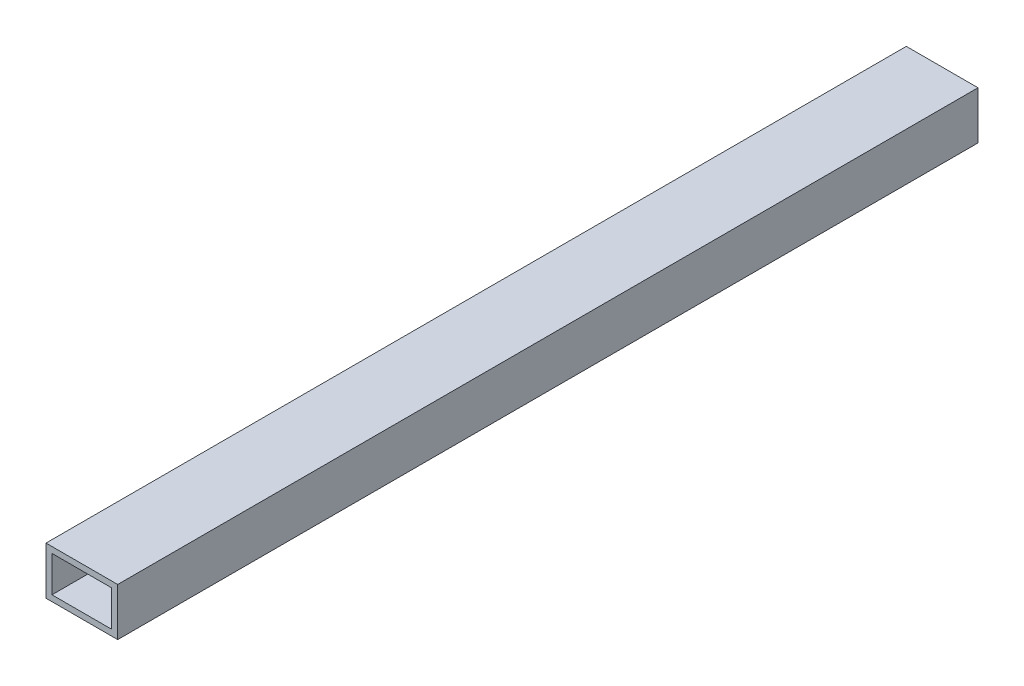
ISO-10303-21;
HEADER;
FILE_DESCRIPTION(('STEP AP214'),'2;1');
FILE_NAME('part.step','',(''),(''),'','','');
FILE_SCHEMA(('AUTOMOTIVE_DESIGN { 1 0 10303 214 1 1 1 1 }'));
ENDSEC;
DATA;
#1=APPLICATION_CONTEXT('core data for automotive mechanical design processes');
#2=APPLICATION_PROTOCOL_DEFINITION('international standard','automotive_design',2000,#1);
#3=PRODUCT_CONTEXT('',#1,'mechanical');
#4=PRODUCT('Part','Part','',(#3));
#5=PRODUCT_RELATED_PRODUCT_CATEGORY('part','',(#4));
#6=PRODUCT_DEFINITION_FORMATION('','',#4);
#7=PRODUCT_DEFINITION_CONTEXT('part definition',#1,'design');
#8=PRODUCT_DEFINITION('design','',#6,#7);
#9=PRODUCT_DEFINITION_SHAPE('','',#8);
#10=(LENGTH_UNIT() NAMED_UNIT(*) SI_UNIT(.MILLI.,.METRE.));
#11=(NAMED_UNIT(*) PLANE_ANGLE_UNIT() SI_UNIT($,.RADIAN.));
#12=(NAMED_UNIT(*) SI_UNIT($,.STERADIAN.) SOLID_ANGLE_UNIT());
#13=UNCERTAINTY_MEASURE_WITH_UNIT(LENGTH_MEASURE(1.E-05),#10,'distance_accuracy_value','');
#14=(GEOMETRIC_REPRESENTATION_CONTEXT(3) GLOBAL_UNCERTAINTY_ASSIGNED_CONTEXT((#13)) GLOBAL_UNIT_ASSIGNED_CONTEXT((#10,
#11,#12)) REPRESENTATION_CONTEXT('',''));
#15=CARTESIAN_POINT('',(0.,0.,0.));
#16=DIRECTION('',(0.,0.,1.));
#17=DIRECTION('',(1.,0.,0.));
#18=AXIS2_PLACEMENT_3D('',#15,#16,#17);
#19=CARTESIAN_POINT('',(0.,0.,228.6));
#20=DIRECTION('',(0.,0.,1.));
#21=DIRECTION('',(1.,0.,0.));
#22=AXIS2_PLACEMENT_3D('',#19,#20,#21);
#23=PLANE('',#22);
#24=DIRECTION('',(0.,-1.,0.));
#25=VECTOR('',#24,1.);
#26=CARTESIAN_POINT('',(-19.05,-12.7,228.6));
#27=LINE('',#26,#25);
#28=CARTESIAN_POINT('',(-19.05,12.7,228.6));
#29=VERTEX_POINT('',#28);
#30=CARTESIAN_POINT('',(-19.05,-12.7,228.6));
#31=VERTEX_POINT('',#30);
#32=EDGE_CURVE('E117',#29,#31,#27,.T.);
#33=ORIENTED_EDGE('',*,*,#32,.T.);
#34=DIRECTION('',(1.,0.,0.));
#35=VECTOR('',#34,1.);
#36=CARTESIAN_POINT('',(19.05,-12.7,228.6));
#37=LINE('',#36,#35);
#38=CARTESIAN_POINT('',(19.05,-12.7,228.6));
#39=VERTEX_POINT('',#38);
#40=EDGE_CURVE('E176',#31,#39,#37,.T.);
#41=ORIENTED_EDGE('',*,*,#40,.T.);
#42=DIRECTION('',(0.,1.,0.));
#43=VECTOR('',#42,1.);
#44=CARTESIAN_POINT('',(19.05,-12.7,228.6));
#45=LINE('',#44,#43);
#46=CARTESIAN_POINT('',(19.05,12.7,228.6));
#47=VERTEX_POINT('',#46);
#48=EDGE_CURVE('E179',#39,#47,#45,.T.);
#49=ORIENTED_EDGE('',*,*,#48,.T.);
#50=DIRECTION('',(-1.,0.,0.));
#51=VECTOR('',#50,1.);
#52=CARTESIAN_POINT('',(19.05,12.7,228.6));
#53=LINE('',#52,#51);
#54=EDGE_CURVE('E63',#47,#29,#53,.T.);
#55=ORIENTED_EDGE('',*,*,#54,.T.);
#56=EDGE_LOOP('',(#33,#41,#49,#55));
#57=FACE_BOUND('',#56,.T.);
#58=DIRECTION('',(1.,0.,0.));
#59=VECTOR('',#58,1.);
#60=CARTESIAN_POINT('',(15.875,-9.525,228.6));
#61=LINE('',#60,#59);
#62=CARTESIAN_POINT('',(-15.875,-9.525,228.6));
#63=VERTEX_POINT('',#62);
#64=CARTESIAN_POINT('',(15.875,-9.525,228.6));
#65=VERTEX_POINT('',#64);
#66=EDGE_CURVE('E158',#63,#65,#61,.T.);
#67=ORIENTED_EDGE('',*,*,#66,.F.);
#68=DIRECTION('',(0.,-1.,0.));
#69=VECTOR('',#68,1.);
#70=CARTESIAN_POINT('',(-15.875,-9.525,228.6));
#71=LINE('',#70,#69);
#72=CARTESIAN_POINT('',(-15.875,9.525,228.6));
#73=VERTEX_POINT('',#72);
#74=EDGE_CURVE('E113',#73,#63,#71,.T.);
#75=ORIENTED_EDGE('',*,*,#74,.F.);
#76=DIRECTION('',(-1.,0.,0.));
#77=VECTOR('',#76,1.);
#78=CARTESIAN_POINT('',(15.875,9.525,228.6));
#79=LINE('',#78,#77);
#80=CARTESIAN_POINT('',(15.875,9.525,228.6));
#81=VERTEX_POINT('',#80);
#82=EDGE_CURVE('E164',#81,#73,#79,.T.);
#83=ORIENTED_EDGE('',*,*,#82,.F.);
#84=DIRECTION('',(0.,1.,0.));
#85=VECTOR('',#84,1.);
#86=CARTESIAN_POINT('',(15.875,-9.525,228.6));
#87=LINE('',#86,#85);
#88=EDGE_CURVE('E161',#65,#81,#87,.T.);
#89=ORIENTED_EDGE('',*,*,#88,.F.);
#90=EDGE_LOOP('',(#67,#75,#83,#89));
#91=FACE_BOUND('',#90,.T.);
#92=ADVANCED_FACE('F39',(#57,#91),#23,.T.);
#93=CARTESIAN_POINT('',(-19.05,-12.7,228.6));
#94=DIRECTION('',(1.,0.,0.));
#95=DIRECTION('',(0.,0.,-1.));
#96=AXIS2_PLACEMENT_3D('',#93,#94,#95);
#97=PLANE('',#96);
#98=DIRECTION('',(0.,0.,-1.));
#99=VECTOR('',#98,1.);
#100=CARTESIAN_POINT('',(-19.05,12.7,228.6));
#101=LINE('',#100,#99);
#102=CARTESIAN_POINT('',(-19.05,12.7,-228.6));
#103=VERTEX_POINT('',#102);
#104=EDGE_CURVE('E184',#29,#103,#101,.T.);
#105=ORIENTED_EDGE('',*,*,#104,.T.);
#106=DIRECTION('',(0.,-1.,0.));
#107=VECTOR('',#106,1.);
#108=CARTESIAN_POINT('',(-19.05,-12.7,-228.6));
#109=LINE('',#108,#107);
#110=CARTESIAN_POINT('',(-19.05,-12.7,-228.6));
#111=VERTEX_POINT('',#110);
#112=EDGE_CURVE('E140',#103,#111,#109,.T.);
#113=ORIENTED_EDGE('',*,*,#112,.T.);
#114=DIRECTION('',(0.,0.,-1.));
#115=VECTOR('',#114,1.);
#116=CARTESIAN_POINT('',(-19.05,-12.7,228.6));
#117=LINE('',#116,#115);
#118=EDGE_CURVE('E11',#31,#111,#117,.T.);
#119=ORIENTED_EDGE('',*,*,#118,.F.);
#120=ORIENTED_EDGE('',*,*,#32,.F.);
#121=EDGE_LOOP('',(#105,#113,#119,#120));
#122=FACE_BOUND('',#121,.T.);
#123=ADVANCED_FACE('F41',(#122),#97,.F.);
#124=CARTESIAN_POINT('',(19.05,-12.7,228.6));
#125=DIRECTION('',(0.,1.,0.));
#126=DIRECTION('',(0.,0.,1.));
#127=AXIS2_PLACEMENT_3D('',#124,#125,#126);
#128=PLANE('',#127);
#129=ORIENTED_EDGE('',*,*,#118,.T.);
#130=DIRECTION('',(1.,0.,0.));
#131=VECTOR('',#130,1.);
#132=CARTESIAN_POINT('',(19.05,-12.7,-228.6));
#133=LINE('',#132,#131);
#134=CARTESIAN_POINT('',(19.05,-12.7,-228.6));
#135=VERTEX_POINT('',#134);
#136=EDGE_CURVE('E144',#111,#135,#133,.T.);
#137=ORIENTED_EDGE('',*,*,#136,.T.);
#138=DIRECTION('',(0.,0.,-1.));
#139=VECTOR('',#138,1.);
#140=CARTESIAN_POINT('',(19.05,-12.7,228.6));
#141=LINE('',#140,#139);
#142=EDGE_CURVE('E48',#39,#135,#141,.T.);
#143=ORIENTED_EDGE('',*,*,#142,.F.);
#144=ORIENTED_EDGE('',*,*,#40,.F.);
#145=EDGE_LOOP('',(#129,#137,#143,#144));
#146=FACE_BOUND('',#145,.T.);
#147=ADVANCED_FACE('F200',(#146),#128,.F.);
#148=CARTESIAN_POINT('',(19.05,-12.7,228.6));
#149=DIRECTION('',(-1.,0.,0.));
#150=DIRECTION('',(0.,-1.,0.));
#151=AXIS2_PLACEMENT_3D('',#148,#149,#150);
#152=PLANE('',#151);
#153=ORIENTED_EDGE('',*,*,#142,.T.);
#154=DIRECTION('',(0.,1.,0.));
#155=VECTOR('',#154,1.);
#156=CARTESIAN_POINT('',(19.05,-12.7,-228.6));
#157=LINE('',#156,#155);
#158=CARTESIAN_POINT('',(19.05,12.7,-228.6));
#159=VERTEX_POINT('',#158);
#160=EDGE_CURVE('E148',#135,#159,#157,.T.);
#161=ORIENTED_EDGE('',*,*,#160,.T.);
#162=DIRECTION('',(0.,0.,-1.));
#163=VECTOR('',#162,1.);
#164=CARTESIAN_POINT('',(19.05,12.7,228.6));
#165=LINE('',#164,#163);
#166=EDGE_CURVE('E187',#47,#159,#165,.T.);
#167=ORIENTED_EDGE('',*,*,#166,.F.);
#168=ORIENTED_EDGE('',*,*,#48,.F.);
#169=EDGE_LOOP('',(#153,#161,#167,#168));
#170=FACE_BOUND('',#169,.T.);
#171=ADVANCED_FACE('F194',(#170),#152,.F.);
#172=CARTESIAN_POINT('',(19.05,12.7,228.6));
#173=DIRECTION('',(0.,-1.,0.));
#174=DIRECTION('',(0.,0.,-1.));
#175=AXIS2_PLACEMENT_3D('',#172,#173,#174);
#176=PLANE('',#175);
#177=ORIENTED_EDGE('',*,*,#166,.T.);
#178=DIRECTION('',(-1.,0.,0.));
#179=VECTOR('',#178,1.);
#180=CARTESIAN_POINT('',(19.05,12.7,-228.6));
#181=LINE('',#180,#179);
#182=EDGE_CURVE('E152',#159,#103,#181,.T.);
#183=ORIENTED_EDGE('',*,*,#182,.T.);
#184=ORIENTED_EDGE('',*,*,#104,.F.);
#185=ORIENTED_EDGE('',*,*,#54,.F.);
#186=EDGE_LOOP('',(#177,#183,#184,#185));
#187=FACE_BOUND('',#186,.T.);
#188=ADVANCED_FACE('F205',(#187),#176,.F.);
#189=CARTESIAN_POINT('',(-15.875,-9.525,228.6));
#190=DIRECTION('',(1.,0.,0.));
#191=DIRECTION('',(0.,0.,-1.));
#192=AXIS2_PLACEMENT_3D('',#189,#190,#191);
#193=PLANE('',#192);
#194=DIRECTION('',(0.,0.,-1.));
#195=VECTOR('',#194,1.);
#196=CARTESIAN_POINT('',(-15.875,-9.525,228.6));
#197=LINE('',#196,#195);
#198=CARTESIAN_POINT('',(-15.875,-9.525,-228.6));
#199=VERTEX_POINT('',#198);
#200=EDGE_CURVE('E105',#63,#199,#197,.T.);
#201=ORIENTED_EDGE('',*,*,#200,.T.);
#202=DIRECTION('',(0.,-1.,0.));
#203=VECTOR('',#202,1.);
#204=CARTESIAN_POINT('',(-15.875,-9.525,-228.6));
#205=LINE('',#204,#203);
#206=CARTESIAN_POINT('',(-15.875,9.525,-228.6));
#207=VERTEX_POINT('',#206);
#208=EDGE_CURVE('E110',#207,#199,#205,.T.);
#209=ORIENTED_EDGE('',*,*,#208,.F.);
#210=DIRECTION('',(0.,0.,-1.));
#211=VECTOR('',#210,1.);
#212=CARTESIAN_POINT('',(-15.875,9.525,228.6));
#213=LINE('',#212,#211);
#214=EDGE_CURVE('E167',#73,#207,#213,.T.);
#215=ORIENTED_EDGE('',*,*,#214,.F.);
#216=ORIENTED_EDGE('',*,*,#74,.T.);
#217=EDGE_LOOP('',(#201,#209,#215,#216));
#218=FACE_BOUND('',#217,.T.);
#219=ADVANCED_FACE('F107',(#218),#193,.T.);
#220=CARTESIAN_POINT('',(15.875,-9.525,228.6));
#221=DIRECTION('',(0.,1.,0.));
#222=DIRECTION('',(0.,0.,1.));
#223=AXIS2_PLACEMENT_3D('',#220,#221,#222);
#224=PLANE('',#223);
#225=DIRECTION('',(0.,0.,-1.));
#226=VECTOR('',#225,1.);
#227=CARTESIAN_POINT('',(15.875,-9.525,228.6));
#228=LINE('',#227,#226);
#229=CARTESIAN_POINT('',(15.875,-9.525,-228.6));
#230=VERTEX_POINT('',#229);
#231=EDGE_CURVE('E118',#65,#230,#228,.T.);
#232=ORIENTED_EDGE('',*,*,#231,.T.);
#233=DIRECTION('',(1.,0.,0.));
#234=VECTOR('',#233,1.);
#235=CARTESIAN_POINT('',(15.875,-9.525,-228.6));
#236=LINE('',#235,#234);
#237=EDGE_CURVE('E121',#199,#230,#236,.T.);
#238=ORIENTED_EDGE('',*,*,#237,.F.);
#239=ORIENTED_EDGE('',*,*,#200,.F.);
#240=ORIENTED_EDGE('',*,*,#66,.T.);
#241=EDGE_LOOP('',(#232,#238,#239,#240));
#242=FACE_BOUND('',#241,.T.);
#243=ADVANCED_FACE('F122',(#242),#224,.T.);
#244=CARTESIAN_POINT('',(15.875,-9.525,228.6));
#245=DIRECTION('',(-1.,0.,0.));
#246=DIRECTION('',(0.,0.,1.));
#247=AXIS2_PLACEMENT_3D('',#244,#245,#246);
#248=PLANE('',#247);
#249=DIRECTION('',(0.,0.,-1.));
#250=VECTOR('',#249,1.);
#251=CARTESIAN_POINT('',(15.875,9.525,228.6));
#252=LINE('',#251,#250);
#253=CARTESIAN_POINT('',(15.875,9.525,-228.6));
#254=VERTEX_POINT('',#253);
#255=EDGE_CURVE('E55',#81,#254,#252,.T.);
#256=ORIENTED_EDGE('',*,*,#255,.T.);
#257=DIRECTION('',(0.,1.,0.));
#258=VECTOR('',#257,1.);
#259=CARTESIAN_POINT('',(15.875,-9.525,-228.6));
#260=LINE('',#259,#258);
#261=EDGE_CURVE('E128',#230,#254,#260,.T.);
#262=ORIENTED_EDGE('',*,*,#261,.F.);
#263=ORIENTED_EDGE('',*,*,#231,.F.);
#264=ORIENTED_EDGE('',*,*,#88,.T.);
#265=EDGE_LOOP('',(#256,#262,#263,#264));
#266=FACE_BOUND('',#265,.T.);
#267=ADVANCED_FACE('F223',(#266),#248,.T.);
#268=CARTESIAN_POINT('',(15.875,9.525,228.6));
#269=DIRECTION('',(0.,-1.,0.));
#270=DIRECTION('',(1.,0.,0.));
#271=AXIS2_PLACEMENT_3D('',#268,#269,#270);
#272=PLANE('',#271);
#273=ORIENTED_EDGE('',*,*,#214,.T.);
#274=DIRECTION('',(-1.,0.,0.));
#275=VECTOR('',#274,1.);
#276=CARTESIAN_POINT('',(15.875,9.525,-228.6));
#277=LINE('',#276,#275);
#278=EDGE_CURVE('E132',#254,#207,#277,.T.);
#279=ORIENTED_EDGE('',*,*,#278,.F.);
#280=ORIENTED_EDGE('',*,*,#255,.F.);
#281=ORIENTED_EDGE('',*,*,#82,.T.);
#282=EDGE_LOOP('',(#273,#279,#280,#281));
#283=FACE_BOUND('',#282,.T.);
#284=ADVANCED_FACE('F226',(#283),#272,.T.);
#285=CARTESIAN_POINT('',(0.,0.,-228.6));
#286=DIRECTION('',(0.,0.,1.));
#287=DIRECTION('',(1.,0.,0.));
#288=AXIS2_PLACEMENT_3D('',#285,#286,#287);
#289=PLANE('',#288);
#290=ORIENTED_EDGE('',*,*,#278,.T.);
#291=ORIENTED_EDGE('',*,*,#208,.T.);
#292=ORIENTED_EDGE('',*,*,#237,.T.);
#293=ORIENTED_EDGE('',*,*,#261,.T.);
#294=EDGE_LOOP('',(#290,#291,#292,#293));
#295=FACE_BOUND('',#294,.T.);
#296=ORIENTED_EDGE('',*,*,#112,.F.);
#297=ORIENTED_EDGE('',*,*,#182,.F.);
#298=ORIENTED_EDGE('',*,*,#160,.F.);
#299=ORIENTED_EDGE('',*,*,#136,.F.);
#300=EDGE_LOOP('',(#296,#297,#298,#299));
#301=FACE_BOUND('',#300,.T.);
#302=ADVANCED_FACE('F130',(#295,#301),#289,.F.);
#303=CLOSED_SHELL('',(#92,#123,#147,#171,#188,#219,#243,#267,#284,#302));
#304=MANIFOLD_SOLID_BREP('B2',#303);
#305=ADVANCED_BREP_SHAPE_REPRESENTATION('',(#18,#304),#14);
#306=SHAPE_DEFINITION_REPRESENTATION(#9,#305);
ENDSEC;
END-ISO-10303-21;
